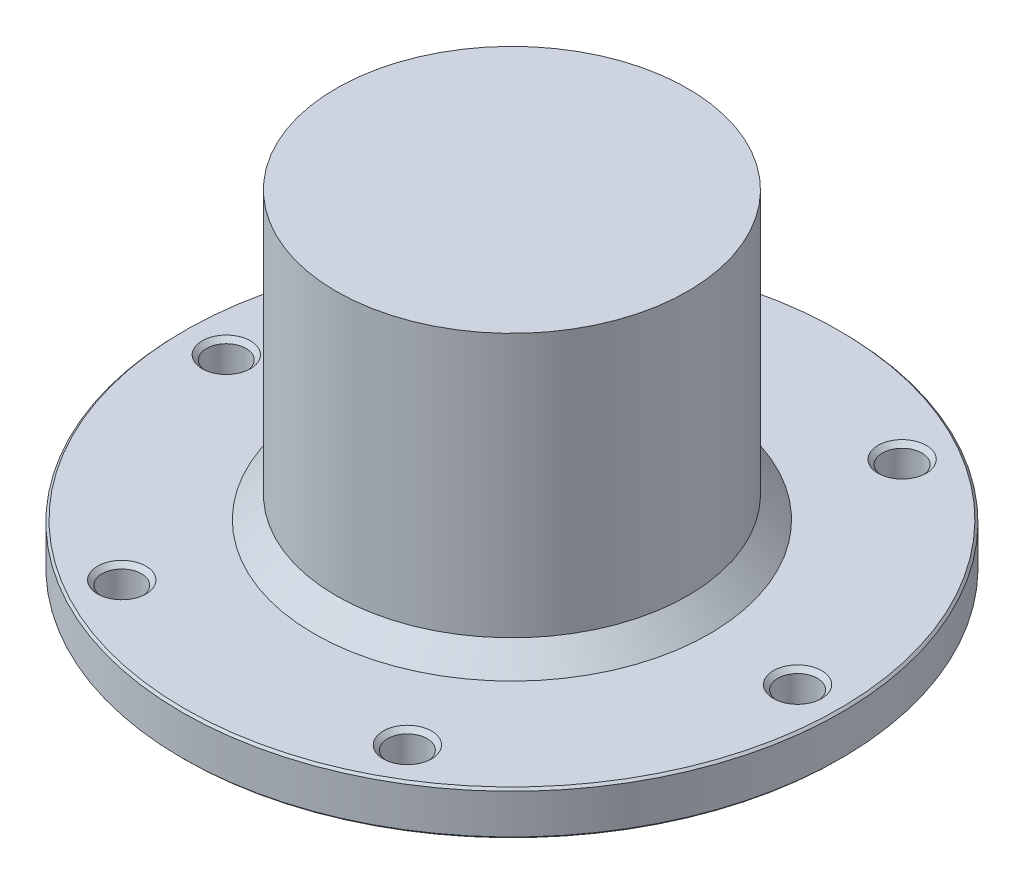
ISO-10303-21;
HEADER;
FILE_DESCRIPTION(('STEP AP214'),'2;1');
FILE_NAME('part.step','',(''),(''),'','','');
FILE_SCHEMA(('AUTOMOTIVE_DESIGN { 1 0 10303 214 1 1 1 1 }'));
ENDSEC;
DATA;
#1=APPLICATION_CONTEXT('core data for automotive mechanical design processes');
#2=APPLICATION_PROTOCOL_DEFINITION('international standard','automotive_design',2000,#1);
#3=PRODUCT_CONTEXT('',#1,'mechanical');
#4=PRODUCT('Part','Part','',(#3));
#5=PRODUCT_RELATED_PRODUCT_CATEGORY('part','',(#4));
#6=PRODUCT_DEFINITION_FORMATION('','',#4);
#7=PRODUCT_DEFINITION_CONTEXT('part definition',#1,'design');
#8=PRODUCT_DEFINITION('design','',#6,#7);
#9=PRODUCT_DEFINITION_SHAPE('','',#8);
#10=(LENGTH_UNIT() NAMED_UNIT(*) SI_UNIT(.MILLI.,.METRE.));
#11=(NAMED_UNIT(*) PLANE_ANGLE_UNIT() SI_UNIT($,.RADIAN.));
#12=(NAMED_UNIT(*) SI_UNIT($,.STERADIAN.) SOLID_ANGLE_UNIT());
#13=UNCERTAINTY_MEASURE_WITH_UNIT(LENGTH_MEASURE(1.E-05),#10,'distance_accuracy_value','');
#14=(GEOMETRIC_REPRESENTATION_CONTEXT(3) GLOBAL_UNCERTAINTY_ASSIGNED_CONTEXT((#13)) GLOBAL_UNIT_ASSIGNED_CONTEXT((#10,
#11,#12)) REPRESENTATION_CONTEXT('',''));
#15=CARTESIAN_POINT('',(0.,0.,0.));
#16=DIRECTION('',(0.,0.,1.));
#17=DIRECTION('',(1.,0.,0.));
#18=AXIS2_PLACEMENT_3D('',#15,#16,#17);
#19=CARTESIAN_POINT('',(0.,20.,0.));
#20=DIRECTION('',(0.,1.,0.));
#21=DIRECTION('',(0.,0.,1.));
#22=AXIS2_PLACEMENT_3D('',#19,#20,#21);
#23=PLANE('',#22);
#24=CARTESIAN_POINT('',(-65.0000000000001,20.,-112.583302491977));
#25=DIRECTION('',(0.,1.,0.));
#26=DIRECTION('',(0.,0.,1.));
#27=AXIS2_PLACEMENT_3D('',#24,#25,#26);
#28=CIRCLE('',#27,11.);
#29=CARTESIAN_POINT('',(-65.0000000000001,20.,-101.583302491977));
#30=VERTEX_POINT('',#29);
#31=EDGE_CURVE('E82',#30,#30,#28,.F.);
#32=ORIENTED_EDGE('',*,*,#31,.T.);
#33=EDGE_LOOP('',(#32));
#34=FACE_BOUND('',#33,.T.);
#35=CARTESIAN_POINT('',(65.,20.,-112.583302491977));
#36=DIRECTION('',(0.,1.,0.));
#37=DIRECTION('',(0.,0.,1.));
#38=AXIS2_PLACEMENT_3D('',#35,#36,#37);
#39=CIRCLE('',#38,11.);
#40=CARTESIAN_POINT('',(65.,20.,-101.583302491977));
#41=VERTEX_POINT('',#40);
#42=EDGE_CURVE('E85',#41,#41,#39,.F.);
#43=ORIENTED_EDGE('',*,*,#42,.T.);
#44=EDGE_LOOP('',(#43));
#45=FACE_BOUND('',#44,.T.);
#46=CARTESIAN_POINT('',(130.,20.,0.));
#47=DIRECTION('',(0.,1.,0.));
#48=DIRECTION('',(0.,0.,1.));
#49=AXIS2_PLACEMENT_3D('',#46,#47,#48);
#50=CIRCLE('',#49,11.);
#51=CARTESIAN_POINT('',(130.,20.,11.));
#52=VERTEX_POINT('',#51);
#53=EDGE_CURVE('E88',#52,#52,#50,.F.);
#54=ORIENTED_EDGE('',*,*,#53,.T.);
#55=EDGE_LOOP('',(#54));
#56=FACE_BOUND('',#55,.T.);
#57=CARTESIAN_POINT('',(65.,20.,112.583302491977));
#58=DIRECTION('',(0.,1.,0.));
#59=DIRECTION('',(0.,0.,1.));
#60=AXIS2_PLACEMENT_3D('',#57,#58,#59);
#61=CIRCLE('',#60,11.);
#62=CARTESIAN_POINT('',(65.,20.,123.583302491977));
#63=VERTEX_POINT('',#62);
#64=EDGE_CURVE('E91',#63,#63,#61,.F.);
#65=ORIENTED_EDGE('',*,*,#64,.T.);
#66=EDGE_LOOP('',(#65));
#67=FACE_BOUND('',#66,.T.);
#68=CARTESIAN_POINT('',(-65.,20.,112.583302491977));
#69=DIRECTION('',(0.,1.,0.));
#70=DIRECTION('',(0.,0.,1.));
#71=AXIS2_PLACEMENT_3D('',#68,#69,#70);
#72=CIRCLE('',#71,11.);
#73=CARTESIAN_POINT('',(-65.,20.,123.583302491977));
#74=VERTEX_POINT('',#73);
#75=EDGE_CURVE('E94',#74,#74,#72,.F.);
#76=ORIENTED_EDGE('',*,*,#75,.T.);
#77=EDGE_LOOP('',(#76));
#78=FACE_BOUND('',#77,.T.);
#79=CARTESIAN_POINT('',(-130.,20.,0.));
#80=DIRECTION('',(0.,1.,0.));
#81=DIRECTION('',(0.,0.,1.));
#82=AXIS2_PLACEMENT_3D('',#79,#80,#81);
#83=CIRCLE('',#82,11.);
#84=CARTESIAN_POINT('',(-130.,20.,11.));
#85=VERTEX_POINT('',#84);
#86=EDGE_CURVE('E97',#85,#85,#83,.F.);
#87=ORIENTED_EDGE('',*,*,#86,.T.);
#88=EDGE_LOOP('',(#87));
#89=FACE_BOUND('',#88,.T.);
#90=CARTESIAN_POINT('',(0.,20.,0.));
#91=DIRECTION('',(0.,1.,0.));
#92=DIRECTION('',(0.,0.,1.));
#93=AXIS2_PLACEMENT_3D('',#90,#91,#92);
#94=CIRCLE('',#93,90.);
#95=CARTESIAN_POINT('',(0.,20.,90.));
#96=VERTEX_POINT('',#95);
#97=EDGE_CURVE('E124',#96,#96,#94,.F.);
#98=ORIENTED_EDGE('',*,*,#97,.T.);
#99=EDGE_LOOP('',(#98));
#100=FACE_BOUND('',#99,.T.);
#101=CARTESIAN_POINT('',(0.,20.,0.));
#102=DIRECTION('',(0.,1.,0.));
#103=DIRECTION('',(0.,0.,1.));
#104=AXIS2_PLACEMENT_3D('',#101,#102,#103);
#105=CIRCLE('',#104,149.);
#106=CARTESIAN_POINT('',(0.,20.,149.));
#107=VERTEX_POINT('',#106);
#108=EDGE_CURVE('E130',#107,#107,#105,.T.);
#109=ORIENTED_EDGE('',*,*,#108,.T.);
#110=EDGE_LOOP('',(#109));
#111=FACE_BOUND('',#110,.T.);
#112=ADVANCED_FACE('F43',(#34,#45,#56,#67,#78,#89,#100,#111),#23,.T.);
#113=CARTESIAN_POINT('',(0.,0.,0.));
#114=DIRECTION('',(0.,1.,0.));
#115=DIRECTION('',(0.,0.,1.));
#116=AXIS2_PLACEMENT_3D('',#113,#114,#115);
#117=PLANE('',#116);
#118=CARTESIAN_POINT('',(-65.0000000000001,0.,-112.583302491977));
#119=DIRECTION('',(0.,1.,0.));
#120=DIRECTION('',(0.,0.,1.));
#121=AXIS2_PLACEMENT_3D('',#118,#119,#120);
#122=CIRCLE('',#121,11.0000000000001);
#123=CARTESIAN_POINT('',(-65.0000000000001,0.,-101.583302491977));
#124=VERTEX_POINT('',#123);
#125=EDGE_CURVE('E106',#124,#124,#122,.T.);
#126=ORIENTED_EDGE('',*,*,#125,.T.);
#127=EDGE_LOOP('',(#126));
#128=FACE_BOUND('',#127,.T.);
#129=CARTESIAN_POINT('',(65.,0.,-112.583302491977));
#130=DIRECTION('',(0.,1.,0.));
#131=DIRECTION('',(0.,0.,1.));
#132=AXIS2_PLACEMENT_3D('',#129,#130,#131);
#133=CIRCLE('',#132,11.0000000000001);
#134=CARTESIAN_POINT('',(65.,0.,-101.583302491977));
#135=VERTEX_POINT('',#134);
#136=EDGE_CURVE('E109',#135,#135,#133,.T.);
#137=ORIENTED_EDGE('',*,*,#136,.T.);
#138=EDGE_LOOP('',(#137));
#139=FACE_BOUND('',#138,.T.);
#140=CARTESIAN_POINT('',(130.,0.,0.));
#141=DIRECTION('',(0.,1.,0.));
#142=DIRECTION('',(0.,0.,1.));
#143=AXIS2_PLACEMENT_3D('',#140,#141,#142);
#144=CIRCLE('',#143,11.);
#145=CARTESIAN_POINT('',(130.,0.,11.));
#146=VERTEX_POINT('',#145);
#147=EDGE_CURVE('E112',#146,#146,#144,.T.);
#148=ORIENTED_EDGE('',*,*,#147,.T.);
#149=EDGE_LOOP('',(#148));
#150=FACE_BOUND('',#149,.T.);
#151=CARTESIAN_POINT('',(65.,0.,112.583302491977));
#152=DIRECTION('',(0.,1.,0.));
#153=DIRECTION('',(0.,0.,1.));
#154=AXIS2_PLACEMENT_3D('',#151,#152,#153);
#155=CIRCLE('',#154,11.0000000000001);
#156=CARTESIAN_POINT('',(65.,0.,123.583302491977));
#157=VERTEX_POINT('',#156);
#158=EDGE_CURVE('E115',#157,#157,#155,.T.);
#159=ORIENTED_EDGE('',*,*,#158,.T.);
#160=EDGE_LOOP('',(#159));
#161=FACE_BOUND('',#160,.T.);
#162=CARTESIAN_POINT('',(-65.,0.,112.583302491977));
#163=DIRECTION('',(0.,1.,0.));
#164=DIRECTION('',(0.,0.,1.));
#165=AXIS2_PLACEMENT_3D('',#162,#163,#164);
#166=CIRCLE('',#165,11.0000000000001);
#167=CARTESIAN_POINT('',(-65.,0.,123.583302491977));
#168=VERTEX_POINT('',#167);
#169=EDGE_CURVE('E118',#168,#168,#166,.T.);
#170=ORIENTED_EDGE('',*,*,#169,.T.);
#171=EDGE_LOOP('',(#170));
#172=FACE_BOUND('',#171,.T.);
#173=CARTESIAN_POINT('',(-130.,0.,0.));
#174=DIRECTION('',(0.,1.,0.));
#175=DIRECTION('',(0.,0.,1.));
#176=AXIS2_PLACEMENT_3D('',#173,#174,#175);
#177=CIRCLE('',#176,11.);
#178=CARTESIAN_POINT('',(-130.,0.,11.));
#179=VERTEX_POINT('',#178);
#180=EDGE_CURVE('E121',#179,#179,#177,.T.);
#181=ORIENTED_EDGE('',*,*,#180,.T.);
#182=EDGE_LOOP('',(#181));
#183=FACE_BOUND('',#182,.T.);
#184=CARTESIAN_POINT('',(0.,0.,0.));
#185=DIRECTION('',(0.,1.,0.));
#186=DIRECTION('',(0.,0.,1.));
#187=AXIS2_PLACEMENT_3D('',#184,#185,#186);
#188=CIRCLE('',#187,149.);
#189=CARTESIAN_POINT('',(0.,0.,149.));
#190=VERTEX_POINT('',#189);
#191=EDGE_CURVE('E133',#190,#190,#188,.F.);
#192=ORIENTED_EDGE('',*,*,#191,.T.);
#193=EDGE_LOOP('',(#192));
#194=FACE_BOUND('',#193,.T.);
#195=ADVANCED_FACE('F165',(#128,#139,#150,#161,#172,#183,#194),#117,.F.);
#196=CARTESIAN_POINT('',(0.,20.,0.));
#197=DIRECTION('',(0.,-1.,0.));
#198=DIRECTION('',(0.,0.,-1.));
#199=AXIS2_PLACEMENT_3D('',#196,#197,#198);
#200=CYLINDRICAL_SURFACE('',#199,150.);
#201=CARTESIAN_POINT('',(0.,0.999999999999945,0.));
#202=DIRECTION('',(0.,1.,0.));
#203=DIRECTION('',(0.,0.,1.));
#204=AXIS2_PLACEMENT_3D('',#201,#202,#203);
#205=CIRCLE('',#204,150.);
#206=CARTESIAN_POINT('',(0.,0.999999999999945,150.));
#207=VERTEX_POINT('',#206);
#208=EDGE_CURVE('E136',#207,#207,#205,.T.);
#209=ORIENTED_EDGE('',*,*,#208,.T.);
#210=EDGE_LOOP('',(#209));
#211=FACE_BOUND('',#210,.T.);
#212=CARTESIAN_POINT('',(0.,18.9999999999999,0.));
#213=DIRECTION('',(0.,1.,0.));
#214=DIRECTION('',(0.,0.,1.));
#215=AXIS2_PLACEMENT_3D('',#212,#213,#214);
#216=CIRCLE('',#215,150.);
#217=CARTESIAN_POINT('',(0.,18.9999999999999,150.));
#218=VERTEX_POINT('',#217);
#219=EDGE_CURVE('E139',#218,#218,#216,.F.);
#220=ORIENTED_EDGE('',*,*,#219,.T.);
#221=EDGE_LOOP('',(#220));
#222=FACE_BOUND('',#221,.T.);
#223=ADVANCED_FACE('F171',(#211,#222),#200,.T.);
#224=CARTESIAN_POINT('',(130.,20.,0.));
#225=DIRECTION('',(0.,-1.,0.));
#226=DIRECTION('',(0.,0.,-1.));
#227=AXIS2_PLACEMENT_3D('',#224,#225,#226);
#228=CYLINDRICAL_SURFACE('',#227,9.00000000000001);
#229=CARTESIAN_POINT('',(130.,1.99999999999997,0.));
#230=DIRECTION('',(0.,1.,0.));
#231=DIRECTION('',(0.,0.,1.));
#232=AXIS2_PLACEMENT_3D('',#229,#230,#231);
#233=CIRCLE('',#232,9.00000000000001);
#234=CARTESIAN_POINT('',(130.,1.99999999999997,9.00000000000001));
#235=VERTEX_POINT('',#234);
#236=EDGE_CURVE('E70',#235,#235,#233,.F.);
#237=ORIENTED_EDGE('',*,*,#236,.T.);
#238=EDGE_LOOP('',(#237));
#239=FACE_BOUND('',#238,.T.);
#240=CARTESIAN_POINT('',(130.,18.0000000000001,0.));
#241=DIRECTION('',(0.,1.,0.));
#242=DIRECTION('',(0.,0.,1.));
#243=AXIS2_PLACEMENT_3D('',#240,#241,#242);
#244=CIRCLE('',#243,9.00000000000001);
#245=CARTESIAN_POINT('',(130.,18.0000000000001,9.00000000000001));
#246=VERTEX_POINT('',#245);
#247=EDGE_CURVE('E73',#246,#246,#244,.T.);
#248=ORIENTED_EDGE('',*,*,#247,.T.);
#249=EDGE_LOOP('',(#248));
#250=FACE_BOUND('',#249,.T.);
#251=ADVANCED_FACE('F176',(#239,#250),#228,.F.);
#252=CARTESIAN_POINT('',(65.,20.,112.583302491977));
#253=DIRECTION('',(0.,-1.,0.));
#254=DIRECTION('',(0.,0.,-1.));
#255=AXIS2_PLACEMENT_3D('',#252,#253,#254);
#256=CYLINDRICAL_SURFACE('',#255,9.00000000000001);
#257=CARTESIAN_POINT('',(65.,2.00000000000002,112.583302491977));
#258=DIRECTION('',(0.,1.,0.));
#259=DIRECTION('',(0.,0.,1.));
#260=AXIS2_PLACEMENT_3D('',#257,#258,#259);
#261=CIRCLE('',#260,9.00000000000001);
#262=CARTESIAN_POINT('',(65.,2.00000000000002,121.583302491977));
#263=VERTEX_POINT('',#262);
#264=EDGE_CURVE('E64',#263,#263,#261,.F.);
#265=ORIENTED_EDGE('',*,*,#264,.T.);
#266=EDGE_LOOP('',(#265));
#267=FACE_BOUND('',#266,.T.);
#268=CARTESIAN_POINT('',(65.,18.0000000000001,112.583302491977));
#269=DIRECTION('',(0.,1.,0.));
#270=DIRECTION('',(0.,0.,1.));
#271=AXIS2_PLACEMENT_3D('',#268,#269,#270);
#272=CIRCLE('',#271,9.00000000000001);
#273=CARTESIAN_POINT('',(65.,18.0000000000001,121.583302491977));
#274=VERTEX_POINT('',#273);
#275=EDGE_CURVE('E67',#274,#274,#272,.T.);
#276=ORIENTED_EDGE('',*,*,#275,.T.);
#277=EDGE_LOOP('',(#276));
#278=FACE_BOUND('',#277,.T.);
#279=ADVANCED_FACE('F427',(#267,#278),#256,.F.);
#280=CARTESIAN_POINT('',(-65.,20.,112.583302491977));
#281=DIRECTION('',(0.,-1.,0.));
#282=DIRECTION('',(0.,0.,-1.));
#283=AXIS2_PLACEMENT_3D('',#280,#281,#282);
#284=CYLINDRICAL_SURFACE('',#283,9.00000000000001);
#285=CARTESIAN_POINT('',(-65.,2.00000000000002,112.583302491977));
#286=DIRECTION('',(0.,1.,0.));
#287=DIRECTION('',(0.,0.,1.));
#288=AXIS2_PLACEMENT_3D('',#285,#286,#287);
#289=CIRCLE('',#288,9.00000000000001);
#290=CARTESIAN_POINT('',(-65.,2.00000000000002,121.583302491977));
#291=VERTEX_POINT('',#290);
#292=EDGE_CURVE('E55',#291,#291,#289,.F.);
#293=ORIENTED_EDGE('',*,*,#292,.T.);
#294=EDGE_LOOP('',(#293));
#295=FACE_BOUND('',#294,.T.);
#296=CARTESIAN_POINT('',(-65.,18.0000000000001,112.583302491977));
#297=DIRECTION('',(0.,1.,0.));
#298=DIRECTION('',(0.,0.,1.));
#299=AXIS2_PLACEMENT_3D('',#296,#297,#298);
#300=CIRCLE('',#299,9.00000000000001);
#301=CARTESIAN_POINT('',(-65.,18.0000000000001,121.583302491977));
#302=VERTEX_POINT('',#301);
#303=EDGE_CURVE('E59',#302,#302,#300,.T.);
#304=ORIENTED_EDGE('',*,*,#303,.T.);
#305=EDGE_LOOP('',(#304));
#306=FACE_BOUND('',#305,.T.);
#307=ADVANCED_FACE('F418',(#295,#306),#284,.F.);
#308=CARTESIAN_POINT('',(-130.,20.,0.));
#309=DIRECTION('',(0.,-1.,0.));
#310=DIRECTION('',(0.,0.,-1.));
#311=AXIS2_PLACEMENT_3D('',#308,#309,#310);
#312=CYLINDRICAL_SURFACE('',#311,9.);
#313=CARTESIAN_POINT('',(-130.,1.99999999999998,0.));
#314=DIRECTION('',(0.,1.,0.));
#315=DIRECTION('',(0.,0.,1.));
#316=AXIS2_PLACEMENT_3D('',#313,#314,#315);
#317=CIRCLE('',#316,9.);
#318=CARTESIAN_POINT('',(-130.,1.99999999999998,9.00000000000001));
#319=VERTEX_POINT('',#318);
#320=EDGE_CURVE('E10',#319,#319,#317,.F.);
#321=ORIENTED_EDGE('',*,*,#320,.T.);
#322=EDGE_LOOP('',(#321));
#323=FACE_BOUND('',#322,.T.);
#324=CARTESIAN_POINT('',(-130.,18.0000000000001,0.));
#325=DIRECTION('',(0.,1.,0.));
#326=DIRECTION('',(0.,0.,1.));
#327=AXIS2_PLACEMENT_3D('',#324,#325,#326);
#328=CIRCLE('',#327,9.);
#329=CARTESIAN_POINT('',(-130.,18.0000000000001,9.00000000000001));
#330=VERTEX_POINT('',#329);
#331=EDGE_CURVE('E51',#330,#330,#328,.T.);
#332=ORIENTED_EDGE('',*,*,#331,.T.);
#333=EDGE_LOOP('',(#332));
#334=FACE_BOUND('',#333,.T.);
#335=ADVANCED_FACE('F408',(#323,#334),#312,.F.);
#336=CARTESIAN_POINT('',(-65.0000000000001,20.,-112.583302491977));
#337=DIRECTION('',(0.,-1.,0.));
#338=DIRECTION('',(0.,0.,-1.));
#339=AXIS2_PLACEMENT_3D('',#336,#337,#338);
#340=CYLINDRICAL_SURFACE('',#339,9.00000000000001);
#341=CARTESIAN_POINT('',(-65.0000000000001,2.00000000000002,-112.583302491977));
#342=DIRECTION('',(0.,1.,0.));
#343=DIRECTION('',(0.,0.,1.));
#344=AXIS2_PLACEMENT_3D('',#341,#342,#343);
#345=CIRCLE('',#344,9.00000000000001);
#346=CARTESIAN_POINT('',(-65.0000000000001,2.00000000000002,-103.583302491977));
#347=VERTEX_POINT('',#346);
#348=EDGE_CURVE('E100',#347,#347,#345,.F.);
#349=ORIENTED_EDGE('',*,*,#348,.T.);
#350=EDGE_LOOP('',(#349));
#351=FACE_BOUND('',#350,.T.);
#352=CARTESIAN_POINT('',(-65.0000000000001,18.0000000000001,-112.583302491977));
#353=DIRECTION('',(0.,1.,0.));
#354=DIRECTION('',(0.,0.,1.));
#355=AXIS2_PLACEMENT_3D('',#352,#353,#354);
#356=CIRCLE('',#355,9.00000000000001);
#357=CARTESIAN_POINT('',(-65.0000000000001,18.0000000000001,-103.583302491977));
#358=VERTEX_POINT('',#357);
#359=EDGE_CURVE('E103',#358,#358,#356,.T.);
#360=ORIENTED_EDGE('',*,*,#359,.T.);
#361=EDGE_LOOP('',(#360));
#362=FACE_BOUND('',#361,.T.);
#363=ADVANCED_FACE('F161',(#351,#362),#340,.F.);
#364=CARTESIAN_POINT('',(65.,20.,-112.583302491977));
#365=DIRECTION('',(0.,-1.,0.));
#366=DIRECTION('',(0.,0.,-1.));
#367=AXIS2_PLACEMENT_3D('',#364,#365,#366);
#368=CYLINDRICAL_SURFACE('',#367,9.00000000000001);
#369=CARTESIAN_POINT('',(65.,2.00000000000002,-112.583302491977));
#370=DIRECTION('',(0.,1.,0.));
#371=DIRECTION('',(0.,0.,1.));
#372=AXIS2_PLACEMENT_3D('',#369,#370,#371);
#373=CIRCLE('',#372,9.00000000000001);
#374=CARTESIAN_POINT('',(65.,2.00000000000002,-103.583302491977));
#375=VERTEX_POINT('',#374);
#376=EDGE_CURVE('E76',#375,#375,#373,.F.);
#377=ORIENTED_EDGE('',*,*,#376,.T.);
#378=EDGE_LOOP('',(#377));
#379=FACE_BOUND('',#378,.T.);
#380=CARTESIAN_POINT('',(65.,18.0000000000001,-112.583302491977));
#381=DIRECTION('',(0.,1.,0.));
#382=DIRECTION('',(0.,0.,1.));
#383=AXIS2_PLACEMENT_3D('',#380,#381,#382);
#384=CIRCLE('',#383,9.00000000000001);
#385=CARTESIAN_POINT('',(65.,18.0000000000001,-103.583302491977));
#386=VERTEX_POINT('',#385);
#387=EDGE_CURVE('E79',#386,#386,#384,.T.);
#388=ORIENTED_EDGE('',*,*,#387,.T.);
#389=EDGE_LOOP('',(#388));
#390=FACE_BOUND('',#389,.T.);
#391=ADVANCED_FACE('F150',(#379,#390),#368,.F.);
#392=CARTESIAN_POINT('',(0.,150.,0.));
#393=DIRECTION('',(0.,-1.,0.));
#394=DIRECTION('',(0.,0.,-1.));
#395=AXIS2_PLACEMENT_3D('',#392,#393,#394);
#396=CYLINDRICAL_SURFACE('',#395,80.);
#397=CARTESIAN_POINT('',(0.,30.0000000000001,0.));
#398=DIRECTION('',(0.,1.,0.));
#399=DIRECTION('',(0.,0.,1.));
#400=AXIS2_PLACEMENT_3D('',#397,#398,#399);
#401=CIRCLE('',#400,80.);
#402=CARTESIAN_POINT('',(0.,30.0000000000001,80.));
#403=VERTEX_POINT('',#402);
#404=EDGE_CURVE('E127',#403,#403,#401,.T.);
#405=ORIENTED_EDGE('',*,*,#404,.T.);
#406=EDGE_LOOP('',(#405));
#407=FACE_BOUND('',#406,.T.);
#408=CARTESIAN_POINT('',(0.,150.,0.));
#409=DIRECTION('',(0.,1.,0.));
#410=DIRECTION('',(0.,0.,1.));
#411=AXIS2_PLACEMENT_3D('',#408,#409,#410);
#412=CIRCLE('',#411,80.);
#413=CARTESIAN_POINT('',(0.,150.,80.));
#414=VERTEX_POINT('',#413);
#415=EDGE_CURVE('E142',#414,#414,#412,.T.);
#416=ORIENTED_EDGE('',*,*,#415,.F.);
#417=EDGE_LOOP('',(#416));
#418=FACE_BOUND('',#417,.T.);
#419=ADVANCED_FACE('F148',(#407,#418),#396,.T.);
#420=CARTESIAN_POINT('',(0.,150.,0.));
#421=DIRECTION('',(0.,1.,0.));
#422=DIRECTION('',(0.,0.,1.));
#423=AXIS2_PLACEMENT_3D('',#420,#421,#422);
#424=PLANE('',#423);
#425=ORIENTED_EDGE('',*,*,#415,.T.);
#426=EDGE_LOOP('',(#425));
#427=FACE_BOUND('',#426,.T.);
#428=ADVANCED_FACE('F146',(#427),#424,.T.);
#429=CARTESIAN_POINT('',(0.,0.999999999999945,0.));
#430=DIRECTION('',(0.,1.,0.));
#431=DIRECTION('',(0.,0.,1.));
#432=AXIS2_PLACEMENT_3D('',#429,#430,#431);
#433=CONICAL_SURFACE('',#432,150.,0.785398163397476);
#434=ORIENTED_EDGE('',*,*,#191,.F.);
#435=EDGE_LOOP('',(#434));
#436=FACE_BOUND('',#435,.T.);
#437=ORIENTED_EDGE('',*,*,#208,.F.);
#438=EDGE_LOOP('',(#437));
#439=FACE_BOUND('',#438,.T.);
#440=ADVANCED_FACE('F158',(#436,#439),#433,.T.);
#441=CARTESIAN_POINT('',(0.,20.,0.));
#442=DIRECTION('',(0.,-1.,0.));
#443=DIRECTION('',(0.,0.,-1.));
#444=AXIS2_PLACEMENT_3D('',#441,#442,#443);
#445=CONICAL_SURFACE('',#444,149.,0.785398163397435);
#446=ORIENTED_EDGE('',*,*,#219,.F.);
#447=EDGE_LOOP('',(#446));
#448=FACE_BOUND('',#447,.T.);
#449=ORIENTED_EDGE('',*,*,#108,.F.);
#450=EDGE_LOOP('',(#449));
#451=FACE_BOUND('',#450,.T.);
#452=ADVANCED_FACE('F188',(#448,#451),#445,.T.);
#453=CARTESIAN_POINT('',(0.,30.0000000000001,0.));
#454=DIRECTION('',(0.,-1.,0.));
#455=DIRECTION('',(0.,0.,-1.));
#456=AXIS2_PLACEMENT_3D('',#453,#454,#455);
#457=CONICAL_SURFACE('',#456,80.,0.785398163397442);
#458=ORIENTED_EDGE('',*,*,#97,.F.);
#459=EDGE_LOOP('',(#458));
#460=FACE_BOUND('',#459,.T.);
#461=ORIENTED_EDGE('',*,*,#404,.F.);
#462=EDGE_LOOP('',(#461));
#463=FACE_BOUND('',#462,.T.);
#464=ADVANCED_FACE('F194',(#460,#463),#457,.T.);
#465=CARTESIAN_POINT('',(-65.0000000000001,0.,-112.583302491977));
#466=DIRECTION('',(0.,-1.,0.));
#467=DIRECTION('',(0.,0.,-1.));
#468=AXIS2_PLACEMENT_3D('',#465,#466,#467);
#469=CONICAL_SURFACE('',#468,11.0000000000001,0.785398163397458);
#470=ORIENTED_EDGE('',*,*,#348,.F.);
#471=EDGE_LOOP('',(#470));
#472=FACE_BOUND('',#471,.T.);
#473=ORIENTED_EDGE('',*,*,#125,.F.);
#474=EDGE_LOOP('',(#473));
#475=FACE_BOUND('',#474,.T.);
#476=ADVANCED_FACE('F200',(#472,#475),#469,.F.);
#477=CARTESIAN_POINT('',(-65.0000000000001,18.0000000000001,-112.583302491977));
#478=DIRECTION('',(0.,1.,0.));
#479=DIRECTION('',(0.,0.,1.));
#480=AXIS2_PLACEMENT_3D('',#477,#478,#479);
#481=CONICAL_SURFACE('',#480,9.00000000000001,0.785398163397454);
#482=ORIENTED_EDGE('',*,*,#31,.F.);
#483=EDGE_LOOP('',(#482));
#484=FACE_BOUND('',#483,.T.);
#485=ORIENTED_EDGE('',*,*,#359,.F.);
#486=EDGE_LOOP('',(#485));
#487=FACE_BOUND('',#486,.T.);
#488=ADVANCED_FACE('F207',(#484,#487),#481,.F.);
#489=CARTESIAN_POINT('',(65.,0.,-112.583302491977));
#490=DIRECTION('',(0.,-1.,0.));
#491=DIRECTION('',(0.,0.,-1.));
#492=AXIS2_PLACEMENT_3D('',#489,#490,#491);
#493=CONICAL_SURFACE('',#492,11.0000000000001,0.785398163397458);
#494=ORIENTED_EDGE('',*,*,#376,.F.);
#495=EDGE_LOOP('',(#494));
#496=FACE_BOUND('',#495,.T.);
#497=ORIENTED_EDGE('',*,*,#136,.F.);
#498=EDGE_LOOP('',(#497));
#499=FACE_BOUND('',#498,.T.);
#500=ADVANCED_FACE('F214',(#496,#499),#493,.F.);
#501=CARTESIAN_POINT('',(65.,18.0000000000001,-112.583302491977));
#502=DIRECTION('',(0.,1.,0.));
#503=DIRECTION('',(0.,0.,1.));
#504=AXIS2_PLACEMENT_3D('',#501,#502,#503);
#505=CONICAL_SURFACE('',#504,9.00000000000001,0.785398163397454);
#506=ORIENTED_EDGE('',*,*,#42,.F.);
#507=EDGE_LOOP('',(#506));
#508=FACE_BOUND('',#507,.T.);
#509=ORIENTED_EDGE('',*,*,#387,.F.);
#510=EDGE_LOOP('',(#509));
#511=FACE_BOUND('',#510,.T.);
#512=ADVANCED_FACE('F221',(#508,#511),#505,.F.);
#513=CARTESIAN_POINT('',(130.,0.,0.));
#514=DIRECTION('',(0.,-1.,0.));
#515=DIRECTION('',(0.,0.,-1.));
#516=AXIS2_PLACEMENT_3D('',#513,#514,#515);
#517=CONICAL_SURFACE('',#516,11.,0.785398163397442);
#518=ORIENTED_EDGE('',*,*,#236,.F.);
#519=EDGE_LOOP('',(#518));
#520=FACE_BOUND('',#519,.T.);
#521=ORIENTED_EDGE('',*,*,#147,.F.);
#522=EDGE_LOOP('',(#521));
#523=FACE_BOUND('',#522,.T.);
#524=ADVANCED_FACE('F228',(#520,#523),#517,.F.);
#525=CARTESIAN_POINT('',(130.,18.0000000000001,0.));
#526=DIRECTION('',(0.,1.,0.));
#527=DIRECTION('',(0.,0.,1.));
#528=AXIS2_PLACEMENT_3D('',#525,#526,#527);
#529=CONICAL_SURFACE('',#528,9.00000000000001,0.785398163397455);
#530=ORIENTED_EDGE('',*,*,#53,.F.);
#531=EDGE_LOOP('',(#530));
#532=FACE_BOUND('',#531,.T.);
#533=ORIENTED_EDGE('',*,*,#247,.F.);
#534=EDGE_LOOP('',(#533));
#535=FACE_BOUND('',#534,.T.);
#536=ADVANCED_FACE('F235',(#532,#535),#529,.F.);
#537=CARTESIAN_POINT('',(65.,0.,112.583302491977));
#538=DIRECTION('',(0.,-1.,0.));
#539=DIRECTION('',(0.,0.,-1.));
#540=AXIS2_PLACEMENT_3D('',#537,#538,#539);
#541=CONICAL_SURFACE('',#540,11.0000000000001,0.785398163397458);
#542=ORIENTED_EDGE('',*,*,#264,.F.);
#543=EDGE_LOOP('',(#542));
#544=FACE_BOUND('',#543,.T.);
#545=ORIENTED_EDGE('',*,*,#158,.F.);
#546=EDGE_LOOP('',(#545));
#547=FACE_BOUND('',#546,.T.);
#548=ADVANCED_FACE('F242',(#544,#547),#541,.F.);
#549=CARTESIAN_POINT('',(65.,18.0000000000001,112.583302491977));
#550=DIRECTION('',(0.,1.,0.));
#551=DIRECTION('',(0.,0.,1.));
#552=AXIS2_PLACEMENT_3D('',#549,#550,#551);
#553=CONICAL_SURFACE('',#552,9.00000000000001,0.785398163397454);
#554=ORIENTED_EDGE('',*,*,#64,.F.);
#555=EDGE_LOOP('',(#554));
#556=FACE_BOUND('',#555,.T.);
#557=ORIENTED_EDGE('',*,*,#275,.F.);
#558=EDGE_LOOP('',(#557));
#559=FACE_BOUND('',#558,.T.);
#560=ADVANCED_FACE('F249',(#556,#559),#553,.F.);
#561=CARTESIAN_POINT('',(-65.,0.,112.583302491977));
#562=DIRECTION('',(0.,-1.,0.));
#563=DIRECTION('',(0.,0.,-1.));
#564=AXIS2_PLACEMENT_3D('',#561,#562,#563);
#565=CONICAL_SURFACE('',#564,11.0000000000001,0.785398163397458);
#566=ORIENTED_EDGE('',*,*,#292,.F.);
#567=EDGE_LOOP('',(#566));
#568=FACE_BOUND('',#567,.T.);
#569=ORIENTED_EDGE('',*,*,#169,.F.);
#570=EDGE_LOOP('',(#569));
#571=FACE_BOUND('',#570,.T.);
#572=ADVANCED_FACE('F256',(#568,#571),#565,.F.);
#573=CARTESIAN_POINT('',(-65.,18.0000000000001,112.583302491977));
#574=DIRECTION('',(0.,1.,0.));
#575=DIRECTION('',(0.,0.,1.));
#576=AXIS2_PLACEMENT_3D('',#573,#574,#575);
#577=CONICAL_SURFACE('',#576,9.00000000000001,0.785398163397454);
#578=ORIENTED_EDGE('',*,*,#75,.F.);
#579=EDGE_LOOP('',(#578));
#580=FACE_BOUND('',#579,.T.);
#581=ORIENTED_EDGE('',*,*,#303,.F.);
#582=EDGE_LOOP('',(#581));
#583=FACE_BOUND('',#582,.T.);
#584=ADVANCED_FACE('F263',(#580,#583),#577,.F.);
#585=CARTESIAN_POINT('',(-130.,0.,0.));
#586=DIRECTION('',(0.,-1.,0.));
#587=DIRECTION('',(0.,0.,-1.));
#588=AXIS2_PLACEMENT_3D('',#585,#586,#587);
#589=CONICAL_SURFACE('',#588,11.,0.785398163397442);
#590=ORIENTED_EDGE('',*,*,#320,.F.);
#591=EDGE_LOOP('',(#590));
#592=FACE_BOUND('',#591,.T.);
#593=ORIENTED_EDGE('',*,*,#180,.F.);
#594=EDGE_LOOP('',(#593));
#595=FACE_BOUND('',#594,.T.);
#596=ADVANCED_FACE('F269',(#592,#595),#589,.F.);
#597=CARTESIAN_POINT('',(-130.,18.0000000000001,0.));
#598=DIRECTION('',(0.,1.,0.));
#599=DIRECTION('',(0.,0.,1.));
#600=AXIS2_PLACEMENT_3D('',#597,#598,#599);
#601=CONICAL_SURFACE('',#600,9.,0.785398163397455);
#602=ORIENTED_EDGE('',*,*,#86,.F.);
#603=EDGE_LOOP('',(#602));
#604=FACE_BOUND('',#603,.T.);
#605=ORIENTED_EDGE('',*,*,#331,.F.);
#606=EDGE_LOOP('',(#605));
#607=FACE_BOUND('',#606,.T.);
#608=ADVANCED_FACE('F46',(#604,#607),#601,.F.);
#609=CLOSED_SHELL('',(#112,#195,#223,#251,#279,#307,#335,#363,#391,#419,#428,#440,#452,#464,
#476,#488,#500,#512,#524,#536,#548,#560,#572,#584,#596,#608));
#610=MANIFOLD_SOLID_BREP('B2',#609);
#611=ADVANCED_BREP_SHAPE_REPRESENTATION('',(#18,#610),#14);
#612=SHAPE_DEFINITION_REPRESENTATION(#9,#611);
ENDSEC;
END-ISO-10303-21;
